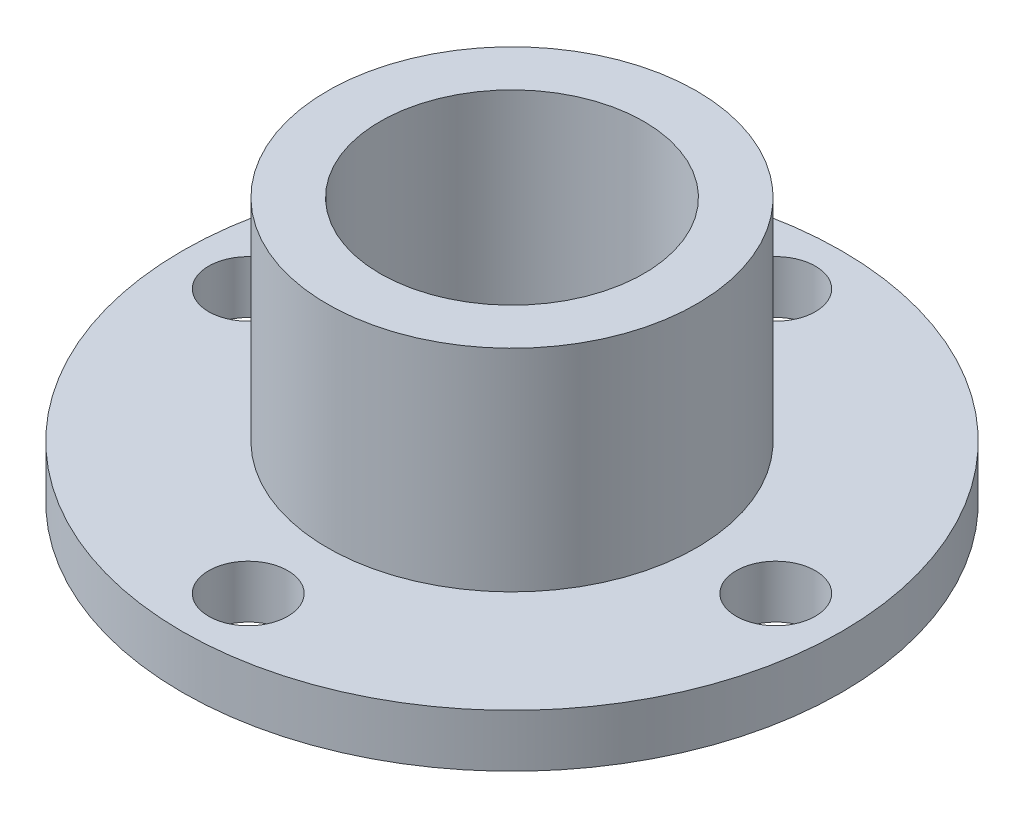
ISO-10303-21;
HEADER;
FILE_DESCRIPTION(('STEP AP214'),'2;1');
FILE_NAME('part.step','',(''),(''),'','','');
FILE_SCHEMA(('AUTOMOTIVE_DESIGN { 1 0 10303 214 1 1 1 1 }'));
ENDSEC;
DATA;
#1=APPLICATION_CONTEXT('core data for automotive mechanical design processes');
#2=APPLICATION_PROTOCOL_DEFINITION('international standard','automotive_design',2000,#1);
#3=PRODUCT_CONTEXT('',#1,'mechanical');
#4=PRODUCT('Part','Part','',(#3));
#5=PRODUCT_RELATED_PRODUCT_CATEGORY('part','',(#4));
#6=PRODUCT_DEFINITION_FORMATION('','',#4);
#7=PRODUCT_DEFINITION_CONTEXT('part definition',#1,'design');
#8=PRODUCT_DEFINITION('design','',#6,#7);
#9=PRODUCT_DEFINITION_SHAPE('','',#8);
#10=(LENGTH_UNIT() NAMED_UNIT(*) SI_UNIT(.MILLI.,.METRE.));
#11=(NAMED_UNIT(*) PLANE_ANGLE_UNIT() SI_UNIT($,.RADIAN.));
#12=(NAMED_UNIT(*) SI_UNIT($,.STERADIAN.) SOLID_ANGLE_UNIT());
#13=UNCERTAINTY_MEASURE_WITH_UNIT(LENGTH_MEASURE(1.E-05),#10,'distance_accuracy_value','');
#14=(GEOMETRIC_REPRESENTATION_CONTEXT(3) GLOBAL_UNCERTAINTY_ASSIGNED_CONTEXT((#13)) GLOBAL_UNIT_ASSIGNED_CONTEXT((#10,
#11,#12)) REPRESENTATION_CONTEXT('',''));
#15=CARTESIAN_POINT('',(0.,0.,0.));
#16=DIRECTION('',(0.,0.,1.));
#17=DIRECTION('',(1.,0.,0.));
#18=AXIS2_PLACEMENT_3D('',#15,#16,#17);
#19=CARTESIAN_POINT('',(0.,-0.941879477049653,0.));
#20=DIRECTION('',(0.,-1.,0.));
#21=DIRECTION('',(0.,0.,-1.));
#22=AXIS2_PLACEMENT_3D('',#19,#20,#21);
#23=CYLINDRICAL_SURFACE('',#22,5.);
#24=CARTESIAN_POINT('',(0.,10.,0.));
#25=DIRECTION('',(0.,-1.,0.));
#26=DIRECTION('',(0.,0.,-1.));
#27=AXIS2_PLACEMENT_3D('',#24,#25,#26);
#28=CIRCLE('',#27,5.);
#29=CARTESIAN_POINT('',(0.,10.,-5.));
#30=VERTEX_POINT('',#29);
#31=EDGE_CURVE('E64',#30,#30,#28,.T.);
#32=ORIENTED_EDGE('',*,*,#31,.F.);
#33=EDGE_LOOP('',(#32));
#34=FACE_BOUND('',#33,.T.);
#35=CARTESIAN_POINT('',(0.,0.,0.));
#36=DIRECTION('',(0.,-1.,0.));
#37=DIRECTION('',(0.,0.,-1.));
#38=AXIS2_PLACEMENT_3D('',#35,#36,#37);
#39=CIRCLE('',#38,4.99999999999999);
#40=CARTESIAN_POINT('',(0.,0.,-4.99999999999999));
#41=VERTEX_POINT('',#40);
#42=EDGE_CURVE('E10',#41,#41,#39,.T.);
#43=ORIENTED_EDGE('',*,*,#42,.T.);
#44=EDGE_LOOP('',(#43));
#45=FACE_BOUND('',#44,.T.);
#46=ADVANCED_FACE('F37',(#34,#45),#23,.F.);
#47=CARTESIAN_POINT('',(0.,0.,4.99999999999999));
#48=DIRECTION('',(0.,1.,0.));
#49=DIRECTION('',(0.,0.,1.));
#50=AXIS2_PLACEMENT_3D('',#47,#48,#49);
#51=PLANE('',#50);
#52=CARTESIAN_POINT('',(0.,0.,-10.));
#53=DIRECTION('',(0.,1.,0.));
#54=DIRECTION('',(0.,0.,1.));
#55=AXIS2_PLACEMENT_3D('',#52,#53,#54);
#56=CIRCLE('',#55,1.5);
#57=CARTESIAN_POINT('',(0.,0.,-8.5));
#58=VERTEX_POINT('',#57);
#59=EDGE_CURVE('E68',#58,#58,#56,.F.);
#60=ORIENTED_EDGE('',*,*,#59,.F.);
#61=EDGE_LOOP('',(#60));
#62=FACE_BOUND('',#61,.T.);
#63=CARTESIAN_POINT('',(10.,0.,0.));
#64=DIRECTION('',(0.,1.,0.));
#65=DIRECTION('',(0.,0.,1.));
#66=AXIS2_PLACEMENT_3D('',#63,#64,#65);
#67=CIRCLE('',#66,1.50000000000003);
#68=CARTESIAN_POINT('',(10.,0.,1.50000000000003));
#69=VERTEX_POINT('',#68);
#70=EDGE_CURVE('E86',#69,#69,#67,.F.);
#71=ORIENTED_EDGE('',*,*,#70,.F.);
#72=EDGE_LOOP('',(#71));
#73=FACE_BOUND('',#72,.T.);
#74=CARTESIAN_POINT('',(0.,0.,10.));
#75=DIRECTION('',(0.,1.,0.));
#76=DIRECTION('',(0.,0.,1.));
#77=AXIS2_PLACEMENT_3D('',#74,#75,#76);
#78=CIRCLE('',#77,1.5);
#79=CARTESIAN_POINT('',(0.,0.,11.5));
#80=VERTEX_POINT('',#79);
#81=EDGE_CURVE('E78',#80,#80,#78,.F.);
#82=ORIENTED_EDGE('',*,*,#81,.F.);
#83=EDGE_LOOP('',(#82));
#84=FACE_BOUND('',#83,.T.);
#85=CARTESIAN_POINT('',(-10.,0.,0.));
#86=DIRECTION('',(0.,1.,0.));
#87=DIRECTION('',(0.,0.,1.));
#88=AXIS2_PLACEMENT_3D('',#85,#86,#87);
#89=CIRCLE('',#88,1.5000000000001);
#90=CARTESIAN_POINT('',(-10.,0.,1.5000000000001));
#91=VERTEX_POINT('',#90);
#92=EDGE_CURVE('E69',#91,#91,#89,.F.);
#93=ORIENTED_EDGE('',*,*,#92,.F.);
#94=EDGE_LOOP('',(#93));
#95=FACE_BOUND('',#94,.T.);
#96=ORIENTED_EDGE('',*,*,#42,.F.);
#97=EDGE_LOOP('',(#96));
#98=FACE_BOUND('',#97,.T.);
#99=CARTESIAN_POINT('',(0.,0.,0.));
#100=DIRECTION('',(0.,-1.,0.));
#101=DIRECTION('',(0.,0.,-1.));
#102=AXIS2_PLACEMENT_3D('',#99,#100,#101);
#103=CIRCLE('',#102,12.5);
#104=CARTESIAN_POINT('',(0.,0.,-12.5));
#105=VERTEX_POINT('',#104);
#106=EDGE_CURVE('E44',#105,#105,#103,.T.);
#107=ORIENTED_EDGE('',*,*,#106,.T.);
#108=EDGE_LOOP('',(#107));
#109=FACE_BOUND('',#108,.T.);
#110=ADVANCED_FACE('F133',(#62,#73,#84,#95,#98,#109),#51,.F.);
#111=CARTESIAN_POINT('',(0.,-0.941879477049653,0.));
#112=DIRECTION('',(0.,-1.,0.));
#113=DIRECTION('',(0.,0.,-1.));
#114=AXIS2_PLACEMENT_3D('',#111,#112,#113);
#115=CYLINDRICAL_SURFACE('',#114,12.5);
#116=ORIENTED_EDGE('',*,*,#106,.F.);
#117=EDGE_LOOP('',(#116));
#118=FACE_BOUND('',#117,.T.);
#119=CARTESIAN_POINT('',(0.,2.,0.));
#120=DIRECTION('',(0.,-1.,0.));
#121=DIRECTION('',(0.,0.,-1.));
#122=AXIS2_PLACEMENT_3D('',#119,#120,#121);
#123=CIRCLE('',#122,12.5);
#124=CARTESIAN_POINT('',(0.,2.,-12.5));
#125=VERTEX_POINT('',#124);
#126=EDGE_CURVE('E49',#125,#125,#123,.T.);
#127=ORIENTED_EDGE('',*,*,#126,.T.);
#128=EDGE_LOOP('',(#127));
#129=FACE_BOUND('',#128,.T.);
#130=ADVANCED_FACE('F108',(#118,#129),#115,.T.);
#131=CARTESIAN_POINT('',(0.,2.,12.5));
#132=DIRECTION('',(0.,-1.,0.));
#133=DIRECTION('',(0.,0.,-1.));
#134=AXIS2_PLACEMENT_3D('',#131,#132,#133);
#135=PLANE('',#134);
#136=CARTESIAN_POINT('',(0.,2.,-10.));
#137=DIRECTION('',(0.,1.,0.));
#138=DIRECTION('',(0.,0.,1.));
#139=AXIS2_PLACEMENT_3D('',#136,#137,#138);
#140=CIRCLE('',#139,1.5);
#141=CARTESIAN_POINT('',(0.,2.,-8.5));
#142=VERTEX_POINT('',#141);
#143=EDGE_CURVE('E90',#142,#142,#140,.T.);
#144=ORIENTED_EDGE('',*,*,#143,.F.);
#145=EDGE_LOOP('',(#144));
#146=FACE_BOUND('',#145,.T.);
#147=CARTESIAN_POINT('',(10.,2.,0.));
#148=DIRECTION('',(0.,1.,0.));
#149=DIRECTION('',(0.,0.,1.));
#150=AXIS2_PLACEMENT_3D('',#147,#148,#149);
#151=CIRCLE('',#150,1.50000000000003);
#152=CARTESIAN_POINT('',(10.,2.,1.50000000000003));
#153=VERTEX_POINT('',#152);
#154=EDGE_CURVE('E82',#153,#153,#151,.T.);
#155=ORIENTED_EDGE('',*,*,#154,.F.);
#156=EDGE_LOOP('',(#155));
#157=FACE_BOUND('',#156,.T.);
#158=CARTESIAN_POINT('',(0.,2.,10.));
#159=DIRECTION('',(0.,1.,0.));
#160=DIRECTION('',(0.,0.,1.));
#161=AXIS2_PLACEMENT_3D('',#158,#159,#160);
#162=CIRCLE('',#161,1.5);
#163=CARTESIAN_POINT('',(0.,2.,11.5));
#164=VERTEX_POINT('',#163);
#165=EDGE_CURVE('E73',#164,#164,#162,.T.);
#166=ORIENTED_EDGE('',*,*,#165,.F.);
#167=EDGE_LOOP('',(#166));
#168=FACE_BOUND('',#167,.T.);
#169=CARTESIAN_POINT('',(-10.,2.,0.));
#170=DIRECTION('',(0.,1.,0.));
#171=DIRECTION('',(0.,0.,1.));
#172=AXIS2_PLACEMENT_3D('',#169,#170,#171);
#173=CIRCLE('',#172,1.5000000000001);
#174=CARTESIAN_POINT('',(-10.,2.,1.5000000000001));
#175=VERTEX_POINT('',#174);
#176=EDGE_CURVE('E74',#175,#175,#173,.T.);
#177=ORIENTED_EDGE('',*,*,#176,.F.);
#178=EDGE_LOOP('',(#177));
#179=FACE_BOUND('',#178,.T.);
#180=ORIENTED_EDGE('',*,*,#126,.F.);
#181=EDGE_LOOP('',(#180));
#182=FACE_BOUND('',#181,.T.);
#183=CARTESIAN_POINT('',(0.,2.,0.));
#184=DIRECTION('',(0.,-1.,0.));
#185=DIRECTION('',(0.,0.,-1.));
#186=AXIS2_PLACEMENT_3D('',#183,#184,#185);
#187=CIRCLE('',#186,7.);
#188=CARTESIAN_POINT('',(0.,2.,-7.));
#189=VERTEX_POINT('',#188);
#190=EDGE_CURVE('E54',#189,#189,#187,.T.);
#191=ORIENTED_EDGE('',*,*,#190,.T.);
#192=EDGE_LOOP('',(#191));
#193=FACE_BOUND('',#192,.T.);
#194=ADVANCED_FACE('F104',(#146,#157,#168,#179,#182,#193),#135,.F.);
#195=CARTESIAN_POINT('',(0.,-0.941879477049653,0.));
#196=DIRECTION('',(0.,-1.,0.));
#197=DIRECTION('',(0.,0.,-1.));
#198=AXIS2_PLACEMENT_3D('',#195,#196,#197);
#199=CYLINDRICAL_SURFACE('',#198,7.);
#200=ORIENTED_EDGE('',*,*,#190,.F.);
#201=EDGE_LOOP('',(#200));
#202=FACE_BOUND('',#201,.T.);
#203=CARTESIAN_POINT('',(0.,10.,0.));
#204=DIRECTION('',(0.,-1.,0.));
#205=DIRECTION('',(0.,0.,-1.));
#206=AXIS2_PLACEMENT_3D('',#203,#204,#205);
#207=CIRCLE('',#206,7.);
#208=CARTESIAN_POINT('',(0.,10.,-7.));
#209=VERTEX_POINT('',#208);
#210=EDGE_CURVE('E60',#209,#209,#207,.T.);
#211=ORIENTED_EDGE('',*,*,#210,.T.);
#212=EDGE_LOOP('',(#211));
#213=FACE_BOUND('',#212,.T.);
#214=ADVANCED_FACE('F107',(#202,#213),#199,.T.);
#215=CARTESIAN_POINT('',(0.,10.,7.));
#216=DIRECTION('',(0.,-1.,0.));
#217=DIRECTION('',(0.,0.,-1.));
#218=AXIS2_PLACEMENT_3D('',#215,#216,#217);
#219=PLANE('',#218);
#220=ORIENTED_EDGE('',*,*,#210,.F.);
#221=EDGE_LOOP('',(#220));
#222=FACE_BOUND('',#221,.T.);
#223=ORIENTED_EDGE('',*,*,#31,.T.);
#224=EDGE_LOOP('',(#223));
#225=FACE_BOUND('',#224,.T.);
#226=ADVANCED_FACE('F122',(#222,#225),#219,.F.);
#227=CARTESIAN_POINT('',(-10.,-0.00100000000000273,0.));
#228=DIRECTION('',(0.,1.,0.));
#229=DIRECTION('',(0.,0.,1.));
#230=AXIS2_PLACEMENT_3D('',#227,#228,#229);
#231=CYLINDRICAL_SURFACE('',#230,1.5000000000001);
#232=ORIENTED_EDGE('',*,*,#176,.T.);
#233=EDGE_LOOP('',(#232));
#234=FACE_BOUND('',#233,.T.);
#235=ORIENTED_EDGE('',*,*,#92,.T.);
#236=EDGE_LOOP('',(#235));
#237=FACE_BOUND('',#236,.T.);
#238=ADVANCED_FACE('F128',(#234,#237),#231,.F.);
#239=CARTESIAN_POINT('',(0.,-0.00100000000000273,10.));
#240=DIRECTION('',(0.,1.,0.));
#241=DIRECTION('',(0.,0.,1.));
#242=AXIS2_PLACEMENT_3D('',#239,#240,#241);
#243=CYLINDRICAL_SURFACE('',#242,1.5);
#244=ORIENTED_EDGE('',*,*,#165,.T.);
#245=EDGE_LOOP('',(#244));
#246=FACE_BOUND('',#245,.T.);
#247=ORIENTED_EDGE('',*,*,#81,.T.);
#248=EDGE_LOOP('',(#247));
#249=FACE_BOUND('',#248,.T.);
#250=ADVANCED_FACE('F148',(#246,#249),#243,.F.);
#251=CARTESIAN_POINT('',(10.,-0.00100000000000273,0.));
#252=DIRECTION('',(0.,1.,0.));
#253=DIRECTION('',(0.,0.,1.));
#254=AXIS2_PLACEMENT_3D('',#251,#252,#253);
#255=CYLINDRICAL_SURFACE('',#254,1.50000000000003);
#256=ORIENTED_EDGE('',*,*,#154,.T.);
#257=EDGE_LOOP('',(#256));
#258=FACE_BOUND('',#257,.T.);
#259=ORIENTED_EDGE('',*,*,#70,.T.);
#260=EDGE_LOOP('',(#259));
#261=FACE_BOUND('',#260,.T.);
#262=ADVANCED_FACE('F152',(#258,#261),#255,.F.);
#263=CARTESIAN_POINT('',(0.,-0.00100000000000273,-10.));
#264=DIRECTION('',(0.,1.,0.));
#265=DIRECTION('',(0.,0.,1.));
#266=AXIS2_PLACEMENT_3D('',#263,#264,#265);
#267=CYLINDRICAL_SURFACE('',#266,1.5);
#268=ORIENTED_EDGE('',*,*,#143,.T.);
#269=EDGE_LOOP('',(#268));
#270=FACE_BOUND('',#269,.T.);
#271=ORIENTED_EDGE('',*,*,#59,.T.);
#272=EDGE_LOOP('',(#271));
#273=FACE_BOUND('',#272,.T.);
#274=ADVANCED_FACE('F101',(#270,#273),#267,.F.);
#275=CLOSED_SHELL('',(#46,#110,#130,#194,#214,#226,#238,#250,#262,#274));
#276=MANIFOLD_SOLID_BREP('B2',#275);
#277=ADVANCED_BREP_SHAPE_REPRESENTATION('',(#18,#276),#14);
#278=SHAPE_DEFINITION_REPRESENTATION(#9,#277);
ENDSEC;
END-ISO-10303-21;
